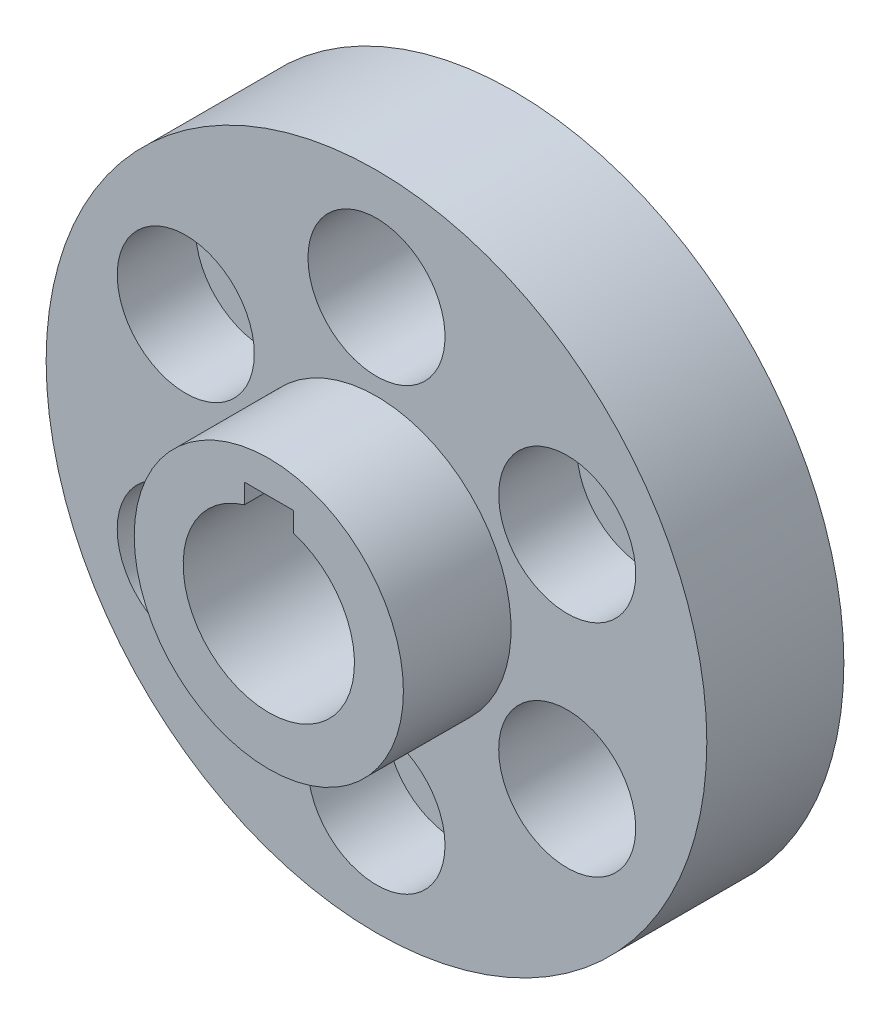
ISO-10303-21;
HEADER;
FILE_DESCRIPTION(('STEP AP214'),'2;1');
FILE_NAME('part.step','',(''),(''),'','','');
FILE_SCHEMA(('AUTOMOTIVE_DESIGN { 1 0 10303 214 1 1 1 1 }'));
ENDSEC;
DATA;
#1=APPLICATION_CONTEXT('core data for automotive mechanical design processes');
#2=APPLICATION_PROTOCOL_DEFINITION('international standard','automotive_design',2000,#1);
#3=PRODUCT_CONTEXT('',#1,'mechanical');
#4=PRODUCT('Part','Part','',(#3));
#5=PRODUCT_RELATED_PRODUCT_CATEGORY('part','',(#4));
#6=PRODUCT_DEFINITION_FORMATION('','',#4);
#7=PRODUCT_DEFINITION_CONTEXT('part definition',#1,'design');
#8=PRODUCT_DEFINITION('design','',#6,#7);
#9=PRODUCT_DEFINITION_SHAPE('','',#8);
#10=(LENGTH_UNIT() NAMED_UNIT(*) SI_UNIT(.MILLI.,.METRE.));
#11=(NAMED_UNIT(*) PLANE_ANGLE_UNIT() SI_UNIT($,.RADIAN.));
#12=(NAMED_UNIT(*) SI_UNIT($,.STERADIAN.) SOLID_ANGLE_UNIT());
#13=UNCERTAINTY_MEASURE_WITH_UNIT(LENGTH_MEASURE(1.E-05),#10,'distance_accuracy_value','');
#14=(GEOMETRIC_REPRESENTATION_CONTEXT(3) GLOBAL_UNCERTAINTY_ASSIGNED_CONTEXT((#13)) GLOBAL_UNIT_ASSIGNED_CONTEXT((#10,
#11,#12)) REPRESENTATION_CONTEXT('',''));
#15=CARTESIAN_POINT('',(0.,0.,0.));
#16=DIRECTION('',(0.,0.,1.));
#17=DIRECTION('',(1.,0.,0.));
#18=AXIS2_PLACEMENT_3D('',#15,#16,#17);
#19=CARTESIAN_POINT('',(0.,0.,50.));
#20=DIRECTION('',(0.,0.,-1.));
#21=DIRECTION('',(-1.,0.,0.));
#22=AXIS2_PLACEMENT_3D('',#19,#20,#21);
#23=CYLINDRICAL_SURFACE('',#22,27.5);
#24=CARTESIAN_POINT('',(0.,0.,50.));
#25=DIRECTION('',(0.,0.,1.));
#26=DIRECTION('',(1.,0.,0.));
#27=AXIS2_PLACEMENT_3D('',#24,#25,#26);
#28=CIRCLE('',#27,27.5);
#29=CARTESIAN_POINT('',(27.5,0.,50.));
#30=VERTEX_POINT('',#29);
#31=EDGE_CURVE('E92',#30,#30,#28,.T.);
#32=ORIENTED_EDGE('',*,*,#31,.F.);
#33=EDGE_LOOP('',(#32));
#34=FACE_BOUND('',#33,.T.);
#35=CARTESIAN_POINT('',(0.,0.,28.));
#36=DIRECTION('',(0.,0.,-1.));
#37=DIRECTION('',(-1.,0.,0.));
#38=AXIS2_PLACEMENT_3D('',#35,#36,#37);
#39=CIRCLE('',#38,27.5);
#40=CARTESIAN_POINT('',(-27.5,0.,28.));
#41=VERTEX_POINT('',#40);
#42=EDGE_CURVE('E101',#41,#41,#39,.T.);
#43=ORIENTED_EDGE('',*,*,#42,.F.);
#44=EDGE_LOOP('',(#43));
#45=FACE_BOUND('',#44,.T.);
#46=ADVANCED_FACE('F42',(#34,#45),#23,.T.);
#47=CARTESIAN_POINT('',(0.,0.,50.));
#48=DIRECTION('',(0.,0.,-1.));
#49=DIRECTION('',(-1.,0.,0.));
#50=AXIS2_PLACEMENT_3D('',#47,#48,#49);
#51=CYLINDRICAL_SURFACE('',#50,17.5);
#52=DIRECTION('',(0.,0.,-1.));
#53=VECTOR('',#52,1.);
#54=CARTESIAN_POINT('',(5.,16.7705098312484,50.));
#55=LINE('',#54,#53);
#56=CARTESIAN_POINT('',(5.,16.7705098312484,50.));
#57=VERTEX_POINT('',#56);
#58=CARTESIAN_POINT('',(5.,16.7705098312484,0.));
#59=VERTEX_POINT('',#58);
#60=EDGE_CURVE('E84',#57,#59,#55,.T.);
#61=ORIENTED_EDGE('',*,*,#60,.T.);
#62=CARTESIAN_POINT('',(0.,0.,0.));
#63=DIRECTION('',(0.,0.,1.));
#64=DIRECTION('',(1.,0.,0.));
#65=AXIS2_PLACEMENT_3D('',#62,#63,#64);
#66=CIRCLE('',#65,17.5);
#67=CARTESIAN_POINT('',(-5.,16.7705098312484,0.));
#68=VERTEX_POINT('',#67);
#69=EDGE_CURVE('E11',#68,#59,#66,.T.);
#70=ORIENTED_EDGE('',*,*,#69,.F.);
#71=DIRECTION('',(0.,0.,-1.));
#72=VECTOR('',#71,1.);
#73=CARTESIAN_POINT('',(-5.,16.7705098312484,50.));
#74=LINE('',#73,#72);
#75=CARTESIAN_POINT('',(-5.,16.7705098312484,50.));
#76=VERTEX_POINT('',#75);
#77=EDGE_CURVE('E116',#76,#68,#74,.T.);
#78=ORIENTED_EDGE('',*,*,#77,.F.);
#79=CARTESIAN_POINT('',(0.,0.,50.));
#80=DIRECTION('',(0.,0.,1.));
#81=DIRECTION('',(1.,0.,0.));
#82=AXIS2_PLACEMENT_3D('',#79,#80,#81);
#83=CIRCLE('',#82,17.5);
#84=EDGE_CURVE('E89',#76,#57,#83,.T.);
#85=ORIENTED_EDGE('',*,*,#84,.T.);
#86=EDGE_LOOP('',(#61,#70,#78,#85));
#87=FACE_BOUND('',#86,.T.);
#88=ADVANCED_FACE('F85',(#87),#51,.F.);
#89=CARTESIAN_POINT('',(5.,20.8,50.));
#90=DIRECTION('',(-1.,0.,0.));
#91=DIRECTION('',(0.,0.,1.));
#92=AXIS2_PLACEMENT_3D('',#89,#90,#91);
#93=PLANE('',#92);
#94=DIRECTION('',(0.,0.,-1.));
#95=VECTOR('',#94,1.);
#96=CARTESIAN_POINT('',(5.,20.8,50.));
#97=LINE('',#96,#95);
#98=CARTESIAN_POINT('',(5.,20.8,50.));
#99=VERTEX_POINT('',#98);
#100=CARTESIAN_POINT('',(5.,20.8,0.));
#101=VERTEX_POINT('',#100);
#102=EDGE_CURVE('E57',#99,#101,#97,.T.);
#103=ORIENTED_EDGE('',*,*,#102,.T.);
#104=DIRECTION('',(0.,1.,0.));
#105=VECTOR('',#104,1.);
#106=CARTESIAN_POINT('',(5.,0.,0.));
#107=LINE('',#106,#105);
#108=EDGE_CURVE('E95',#59,#101,#107,.T.);
#109=ORIENTED_EDGE('',*,*,#108,.F.);
#110=ORIENTED_EDGE('',*,*,#60,.F.);
#111=DIRECTION('',(0.,1.,0.));
#112=VECTOR('',#111,1.);
#113=CARTESIAN_POINT('',(5.,20.8,50.));
#114=LINE('',#113,#112);
#115=EDGE_CURVE('E125',#57,#99,#114,.T.);
#116=ORIENTED_EDGE('',*,*,#115,.T.);
#117=EDGE_LOOP('',(#103,#109,#110,#116));
#118=FACE_BOUND('',#117,.T.);
#119=ADVANCED_FACE('F96',(#118),#93,.T.);
#120=CARTESIAN_POINT('',(-5.,20.8,50.));
#121=DIRECTION('',(0.,-1.,0.));
#122=DIRECTION('',(0.,0.,-1.));
#123=AXIS2_PLACEMENT_3D('',#120,#121,#122);
#124=PLANE('',#123);
#125=DIRECTION('',(0.,0.,-1.));
#126=VECTOR('',#125,1.);
#127=CARTESIAN_POINT('',(-5.,20.8,50.));
#128=LINE('',#127,#126);
#129=CARTESIAN_POINT('',(-5.,20.8,50.));
#130=VERTEX_POINT('',#129);
#131=CARTESIAN_POINT('',(-5.,20.8,0.));
#132=VERTEX_POINT('',#131);
#133=EDGE_CURVE('E65',#130,#132,#128,.T.);
#134=ORIENTED_EDGE('',*,*,#133,.T.);
#135=DIRECTION('',(-1.,0.,0.));
#136=VECTOR('',#135,1.);
#137=CARTESIAN_POINT('',(0.,20.8,0.));
#138=LINE('',#137,#136);
#139=EDGE_CURVE('E100',#101,#132,#138,.T.);
#140=ORIENTED_EDGE('',*,*,#139,.F.);
#141=ORIENTED_EDGE('',*,*,#102,.F.);
#142=DIRECTION('',(-1.,0.,0.));
#143=VECTOR('',#142,1.);
#144=CARTESIAN_POINT('',(-5.,20.8,50.));
#145=LINE('',#144,#143);
#146=EDGE_CURVE('E122',#99,#130,#145,.T.);
#147=ORIENTED_EDGE('',*,*,#146,.T.);
#148=EDGE_LOOP('',(#134,#140,#141,#147));
#149=FACE_BOUND('',#148,.T.);
#150=ADVANCED_FACE('F258',(#149),#124,.T.);
#151=CARTESIAN_POINT('',(-5.,20.8,50.));
#152=DIRECTION('',(1.,0.,0.));
#153=DIRECTION('',(0.,0.,-1.));
#154=AXIS2_PLACEMENT_3D('',#151,#152,#153);
#155=PLANE('',#154);
#156=ORIENTED_EDGE('',*,*,#77,.T.);
#157=DIRECTION('',(0.,-1.,0.));
#158=VECTOR('',#157,1.);
#159=CARTESIAN_POINT('',(-5.,0.,0.));
#160=LINE('',#159,#158);
#161=EDGE_CURVE('E50',#132,#68,#160,.T.);
#162=ORIENTED_EDGE('',*,*,#161,.F.);
#163=ORIENTED_EDGE('',*,*,#133,.F.);
#164=DIRECTION('',(0.,-1.,0.));
#165=VECTOR('',#164,1.);
#166=CARTESIAN_POINT('',(-5.,20.8,50.));
#167=LINE('',#166,#165);
#168=EDGE_CURVE('E119',#130,#76,#167,.T.);
#169=ORIENTED_EDGE('',*,*,#168,.T.);
#170=EDGE_LOOP('',(#156,#162,#163,#169));
#171=FACE_BOUND('',#170,.T.);
#172=ADVANCED_FACE('F253',(#171),#155,.T.);
#173=CARTESIAN_POINT('',(0.,0.,50.));
#174=DIRECTION('',(0.,0.,1.));
#175=DIRECTION('',(1.,0.,0.));
#176=AXIS2_PLACEMENT_3D('',#173,#174,#175);
#177=PLANE('',#176);
#178=ORIENTED_EDGE('',*,*,#31,.T.);
#179=EDGE_LOOP('',(#178));
#180=FACE_BOUND('',#179,.T.);
#181=ORIENTED_EDGE('',*,*,#115,.F.);
#182=ORIENTED_EDGE('',*,*,#84,.F.);
#183=ORIENTED_EDGE('',*,*,#168,.F.);
#184=ORIENTED_EDGE('',*,*,#146,.F.);
#185=EDGE_LOOP('',(#181,#182,#183,#184));
#186=FACE_BOUND('',#185,.T.);
#187=ADVANCED_FACE('F227',(#180,#186),#177,.T.);
#188=CARTESIAN_POINT('',(0.,0.,28.));
#189=DIRECTION('',(0.,0.,-1.));
#190=DIRECTION('',(-1.,0.,0.));
#191=AXIS2_PLACEMENT_3D('',#188,#189,#190);
#192=PLANE('',#191);
#193=CARTESIAN_POINT('',(0.,-45.,28.));
#194=DIRECTION('',(0.,0.,1.));
#195=DIRECTION('',(1.,0.,0.));
#196=AXIS2_PLACEMENT_3D('',#193,#194,#195);
#197=CIRCLE('',#196,14.);
#198=CARTESIAN_POINT('',(14.,-45.,28.));
#199=VERTEX_POINT('',#198);
#200=EDGE_CURVE('E206',#199,#199,#197,.T.);
#201=ORIENTED_EDGE('',*,*,#200,.F.);
#202=EDGE_LOOP('',(#201));
#203=FACE_BOUND('',#202,.T.);
#204=CARTESIAN_POINT('',(-38.9711431702996,22.5000000000002,28.));
#205=DIRECTION('',(0.,0.,1.));
#206=DIRECTION('',(1.,0.,0.));
#207=AXIS2_PLACEMENT_3D('',#204,#205,#206);
#208=CIRCLE('',#207,14.);
#209=CARTESIAN_POINT('',(-24.9711431702996,22.5000000000002,28.));
#210=VERTEX_POINT('',#209);
#211=EDGE_CURVE('E202',#210,#210,#208,.T.);
#212=ORIENTED_EDGE('',*,*,#211,.F.);
#213=EDGE_LOOP('',(#212));
#214=FACE_BOUND('',#213,.T.);
#215=CARTESIAN_POINT('',(38.9711431702999,22.4999999999996,28.));
#216=DIRECTION('',(0.,0.,1.));
#217=DIRECTION('',(1.,0.,0.));
#218=AXIS2_PLACEMENT_3D('',#215,#216,#217);
#219=CIRCLE('',#218,14.);
#220=CARTESIAN_POINT('',(52.9711431703,22.4999999999996,28.));
#221=VERTEX_POINT('',#220);
#222=EDGE_CURVE('E194',#221,#221,#219,.T.);
#223=ORIENTED_EDGE('',*,*,#222,.F.);
#224=EDGE_LOOP('',(#223));
#225=FACE_BOUND('',#224,.T.);
#226=CARTESIAN_POINT('',(0.,0.,28.));
#227=DIRECTION('',(0.,0.,-1.));
#228=DIRECTION('',(-1.,0.,0.));
#229=AXIS2_PLACEMENT_3D('',#226,#227,#228);
#230=CIRCLE('',#229,67.5);
#231=CARTESIAN_POINT('',(-67.5,0.,28.));
#232=VERTEX_POINT('',#231);
#233=EDGE_CURVE('E130',#232,#232,#230,.T.);
#234=ORIENTED_EDGE('',*,*,#233,.F.);
#235=EDGE_LOOP('',(#234));
#236=FACE_BOUND('',#235,.T.);
#237=CARTESIAN_POINT('',(0.,45.,28.));
#238=DIRECTION('',(0.,0.,-1.));
#239=DIRECTION('',(-1.,0.,0.));
#240=AXIS2_PLACEMENT_3D('',#237,#238,#239);
#241=CIRCLE('',#240,14.);
#242=CARTESIAN_POINT('',(-14.,45.,28.));
#243=VERTEX_POINT('',#242);
#244=EDGE_CURVE('E138',#243,#243,#241,.T.);
#245=ORIENTED_EDGE('',*,*,#244,.T.);
#246=EDGE_LOOP('',(#245));
#247=FACE_BOUND('',#246,.T.);
#248=CARTESIAN_POINT('',(-38.9711431702996,-22.5000000000002,28.));
#249=DIRECTION('',(0.,0.,-1.));
#250=DIRECTION('',(-1.,0.,0.));
#251=AXIS2_PLACEMENT_3D('',#248,#249,#250);
#252=CIRCLE('',#251,14.);
#253=CARTESIAN_POINT('',(-52.9711431702996,-22.5000000000002,28.));
#254=VERTEX_POINT('',#253);
#255=EDGE_CURVE('E146',#254,#254,#252,.T.);
#256=ORIENTED_EDGE('',*,*,#255,.T.);
#257=EDGE_LOOP('',(#256));
#258=FACE_BOUND('',#257,.T.);
#259=CARTESIAN_POINT('',(38.9711431702999,-22.4999999999996,28.));
#260=DIRECTION('',(0.,0.,-1.));
#261=DIRECTION('',(-1.,0.,0.));
#262=AXIS2_PLACEMENT_3D('',#259,#260,#261);
#263=CIRCLE('',#262,14.);
#264=CARTESIAN_POINT('',(24.9711431702999,-22.4999999999996,28.));
#265=VERTEX_POINT('',#264);
#266=EDGE_CURVE('E154',#265,#265,#263,.T.);
#267=ORIENTED_EDGE('',*,*,#266,.T.);
#268=EDGE_LOOP('',(#267));
#269=FACE_BOUND('',#268,.T.);
#270=ORIENTED_EDGE('',*,*,#42,.T.);
#271=EDGE_LOOP('',(#270));
#272=FACE_BOUND('',#271,.T.);
#273=ADVANCED_FACE('F223',(#203,#214,#225,#236,#247,#258,#269,#272),#192,.F.);
#274=CARTESIAN_POINT('',(0.,0.,28.));
#275=DIRECTION('',(0.,0.,-1.));
#276=DIRECTION('',(-1.,0.,0.));
#277=AXIS2_PLACEMENT_3D('',#274,#275,#276);
#278=CYLINDRICAL_SURFACE('',#277,67.5);
#279=ORIENTED_EDGE('',*,*,#233,.T.);
#280=EDGE_LOOP('',(#279));
#281=FACE_BOUND('',#280,.T.);
#282=CARTESIAN_POINT('',(0.,0.,0.));
#283=DIRECTION('',(0.,0.,-1.));
#284=DIRECTION('',(-1.,0.,0.));
#285=AXIS2_PLACEMENT_3D('',#282,#283,#284);
#286=CIRCLE('',#285,67.5);
#287=CARTESIAN_POINT('',(-67.5,0.,0.));
#288=VERTEX_POINT('',#287);
#289=EDGE_CURVE('E134',#288,#288,#286,.T.);
#290=ORIENTED_EDGE('',*,*,#289,.F.);
#291=EDGE_LOOP('',(#290));
#292=FACE_BOUND('',#291,.T.);
#293=ADVANCED_FACE('F226',(#281,#292),#278,.T.);
#294=CARTESIAN_POINT('',(0.,45.,28.));
#295=DIRECTION('',(0.,0.,-1.));
#296=DIRECTION('',(-1.,0.,0.));
#297=AXIS2_PLACEMENT_3D('',#294,#295,#296);
#298=CYLINDRICAL_SURFACE('',#297,14.);
#299=ORIENTED_EDGE('',*,*,#244,.F.);
#300=EDGE_LOOP('',(#299));
#301=FACE_BOUND('',#300,.T.);
#302=CARTESIAN_POINT('',(0.,45.,0.));
#303=DIRECTION('',(0.,0.,-1.));
#304=DIRECTION('',(-1.,0.,0.));
#305=AXIS2_PLACEMENT_3D('',#302,#303,#304);
#306=CIRCLE('',#305,14.);
#307=CARTESIAN_POINT('',(-14.,45.,0.));
#308=VERTEX_POINT('',#307);
#309=EDGE_CURVE('E142',#308,#308,#306,.T.);
#310=ORIENTED_EDGE('',*,*,#309,.T.);
#311=EDGE_LOOP('',(#310));
#312=FACE_BOUND('',#311,.T.);
#313=ADVANCED_FACE('F284',(#301,#312),#298,.F.);
#314=CARTESIAN_POINT('',(-38.9711431702996,-22.5000000000002,28.));
#315=DIRECTION('',(0.,0.,-1.));
#316=DIRECTION('',(-1.,0.,0.));
#317=AXIS2_PLACEMENT_3D('',#314,#315,#316);
#318=CYLINDRICAL_SURFACE('',#317,14.);
#319=ORIENTED_EDGE('',*,*,#255,.F.);
#320=EDGE_LOOP('',(#319));
#321=FACE_BOUND('',#320,.T.);
#322=CARTESIAN_POINT('',(-38.9711431702996,-22.5000000000002,0.));
#323=DIRECTION('',(0.,0.,-1.));
#324=DIRECTION('',(-1.,0.,0.));
#325=AXIS2_PLACEMENT_3D('',#322,#323,#324);
#326=CIRCLE('',#325,14.);
#327=CARTESIAN_POINT('',(-52.9711431702996,-22.5000000000002,0.));
#328=VERTEX_POINT('',#327);
#329=EDGE_CURVE('E150',#328,#328,#326,.T.);
#330=ORIENTED_EDGE('',*,*,#329,.T.);
#331=EDGE_LOOP('',(#330));
#332=FACE_BOUND('',#331,.T.);
#333=ADVANCED_FACE('F278',(#321,#332),#318,.F.);
#334=CARTESIAN_POINT('',(38.9711431702999,-22.4999999999996,28.));
#335=DIRECTION('',(0.,0.,-1.));
#336=DIRECTION('',(-1.,0.,0.));
#337=AXIS2_PLACEMENT_3D('',#334,#335,#336);
#338=CYLINDRICAL_SURFACE('',#337,14.);
#339=ORIENTED_EDGE('',*,*,#266,.F.);
#340=EDGE_LOOP('',(#339));
#341=FACE_BOUND('',#340,.T.);
#342=CARTESIAN_POINT('',(38.9711431702999,-22.4999999999996,0.));
#343=DIRECTION('',(0.,0.,-1.));
#344=DIRECTION('',(-1.,0.,0.));
#345=AXIS2_PLACEMENT_3D('',#342,#343,#344);
#346=CIRCLE('',#345,14.);
#347=CARTESIAN_POINT('',(24.9711431702999,-22.4999999999996,0.));
#348=VERTEX_POINT('',#347);
#349=EDGE_CURVE('E158',#348,#348,#346,.T.);
#350=ORIENTED_EDGE('',*,*,#349,.T.);
#351=EDGE_LOOP('',(#350));
#352=FACE_BOUND('',#351,.T.);
#353=ADVANCED_FACE('F270',(#341,#352),#338,.F.);
#354=CARTESIAN_POINT('',(0.,0.,0.));
#355=DIRECTION('',(0.,0.,1.));
#356=DIRECTION('',(1.,0.,0.));
#357=AXIS2_PLACEMENT_3D('',#354,#355,#356);
#358=PLANE('',#357);
#359=ORIENTED_EDGE('',*,*,#161,.T.);
#360=ORIENTED_EDGE('',*,*,#69,.T.);
#361=ORIENTED_EDGE('',*,*,#108,.T.);
#362=ORIENTED_EDGE('',*,*,#139,.T.);
#363=EDGE_LOOP('',(#359,#360,#361,#362));
#364=FACE_BOUND('',#363,.T.);
#365=CARTESIAN_POINT('',(0.,-45.,0.));
#366=DIRECTION('',(0.,0.,-1.));
#367=DIRECTION('',(-1.,0.,0.));
#368=AXIS2_PLACEMENT_3D('',#365,#366,#367);
#369=CIRCLE('',#368,9.);
#370=CARTESIAN_POINT('',(-9.,-45.,0.));
#371=VERTEX_POINT('',#370);
#372=EDGE_CURVE('E162',#371,#371,#369,.T.);
#373=ORIENTED_EDGE('',*,*,#372,.F.);
#374=EDGE_LOOP('',(#373));
#375=FACE_BOUND('',#374,.T.);
#376=CARTESIAN_POINT('',(38.9711431702996,22.5000000000002,0.));
#377=DIRECTION('',(0.,0.,-1.));
#378=DIRECTION('',(-1.,0.,0.));
#379=AXIS2_PLACEMENT_3D('',#376,#377,#378);
#380=CIRCLE('',#379,9.);
#381=CARTESIAN_POINT('',(29.9711431702996,22.5000000000002,0.));
#382=VERTEX_POINT('',#381);
#383=EDGE_CURVE('E170',#382,#382,#380,.T.);
#384=ORIENTED_EDGE('',*,*,#383,.F.);
#385=EDGE_LOOP('',(#384));
#386=FACE_BOUND('',#385,.T.);
#387=CARTESIAN_POINT('',(-38.9711431702999,22.4999999999996,0.));
#388=DIRECTION('',(0.,0.,-1.));
#389=DIRECTION('',(-1.,0.,0.));
#390=AXIS2_PLACEMENT_3D('',#387,#388,#389);
#391=CIRCLE('',#390,9.);
#392=CARTESIAN_POINT('',(-47.9711431702999,22.4999999999996,0.));
#393=VERTEX_POINT('',#392);
#394=EDGE_CURVE('E166',#393,#393,#391,.T.);
#395=ORIENTED_EDGE('',*,*,#394,.F.);
#396=EDGE_LOOP('',(#395));
#397=FACE_BOUND('',#396,.T.);
#398=ORIENTED_EDGE('',*,*,#349,.F.);
#399=EDGE_LOOP('',(#398));
#400=FACE_BOUND('',#399,.T.);
#401=ORIENTED_EDGE('',*,*,#329,.F.);
#402=EDGE_LOOP('',(#401));
#403=FACE_BOUND('',#402,.T.);
#404=ORIENTED_EDGE('',*,*,#309,.F.);
#405=EDGE_LOOP('',(#404));
#406=FACE_BOUND('',#405,.T.);
#407=ORIENTED_EDGE('',*,*,#289,.T.);
#408=EDGE_LOOP('',(#407));
#409=FACE_BOUND('',#408,.T.);
#410=ADVANCED_FACE('F103',(#364,#375,#386,#397,#400,#403,#406,#409),#358,.F.);
#411=CARTESIAN_POINT('',(-38.9711431702999,22.4999999999996,0.));
#412=DIRECTION('',(0.,0.,-1.));
#413=DIRECTION('',(-1.,0.,0.));
#414=AXIS2_PLACEMENT_3D('',#411,#412,#413);
#415=CONICAL_SURFACE('',#414,9.,0.130899693899575);
#416=CARTESIAN_POINT('',(-38.9711431702999,22.4999999999996,12.));
#417=DIRECTION('',(0.,0.,-1.));
#418=DIRECTION('',(-1.,0.,0.));
#419=AXIS2_PLACEMENT_3D('',#416,#417,#418);
#420=CIRCLE('',#419,7.42017002895125);
#421=CARTESIAN_POINT('',(-46.3913131992512,22.4999999999996,12.));
#422=VERTEX_POINT('',#421);
#423=EDGE_CURVE('E171',#422,#422,#420,.T.);
#424=ORIENTED_EDGE('',*,*,#423,.F.);
#425=EDGE_LOOP('',(#424));
#426=FACE_BOUND('',#425,.T.);
#427=ORIENTED_EDGE('',*,*,#394,.T.);
#428=EDGE_LOOP('',(#427));
#429=FACE_BOUND('',#428,.T.);
#430=ADVANCED_FACE('F269',(#426,#429),#415,.F.);
#431=CARTESIAN_POINT('',(38.9711431702996,22.5000000000002,0.));
#432=DIRECTION('',(0.,0.,-1.));
#433=DIRECTION('',(-1.,0.,0.));
#434=AXIS2_PLACEMENT_3D('',#431,#432,#433);
#435=CONICAL_SURFACE('',#434,9.,0.130899693899575);
#436=CARTESIAN_POINT('',(38.9711431702996,22.5000000000002,12.));
#437=DIRECTION('',(0.,0.,-1.));
#438=DIRECTION('',(-1.,0.,0.));
#439=AXIS2_PLACEMENT_3D('',#436,#437,#438);
#440=CIRCLE('',#439,7.42017002895125);
#441=CARTESIAN_POINT('',(31.5509731413484,22.5000000000002,12.));
#442=VERTEX_POINT('',#441);
#443=EDGE_CURVE('E175',#442,#442,#440,.T.);
#444=ORIENTED_EDGE('',*,*,#443,.F.);
#445=EDGE_LOOP('',(#444));
#446=FACE_BOUND('',#445,.T.);
#447=ORIENTED_EDGE('',*,*,#383,.T.);
#448=EDGE_LOOP('',(#447));
#449=FACE_BOUND('',#448,.T.);
#450=ADVANCED_FACE('F275',(#446,#449),#435,.F.);
#451=CARTESIAN_POINT('',(0.,-45.,0.));
#452=DIRECTION('',(0.,0.,-1.));
#453=DIRECTION('',(-1.,0.,0.));
#454=AXIS2_PLACEMENT_3D('',#451,#452,#453);
#455=CONICAL_SURFACE('',#454,9.,0.130899693899575);
#456=CARTESIAN_POINT('',(0.,-45.,12.));
#457=DIRECTION('',(0.,0.,-1.));
#458=DIRECTION('',(-1.,0.,0.));
#459=AXIS2_PLACEMENT_3D('',#456,#457,#458);
#460=CIRCLE('',#459,7.42017002895125);
#461=CARTESIAN_POINT('',(-7.42017002895125,-45.,12.));
#462=VERTEX_POINT('',#461);
#463=EDGE_CURVE('E182',#462,#462,#460,.T.);
#464=ORIENTED_EDGE('',*,*,#463,.F.);
#465=EDGE_LOOP('',(#464));
#466=FACE_BOUND('',#465,.T.);
#467=ORIENTED_EDGE('',*,*,#372,.T.);
#468=EDGE_LOOP('',(#467));
#469=FACE_BOUND('',#468,.T.);
#470=ADVANCED_FACE('F367',(#466,#469),#455,.F.);
#471=CARTESIAN_POINT('',(38.9711431702999,22.4999999999996,12.));
#472=DIRECTION('',(0.,0.,1.));
#473=DIRECTION('',(1.,0.,0.));
#474=AXIS2_PLACEMENT_3D('',#471,#472,#473);
#475=PLANE('',#474);
#476=CARTESIAN_POINT('',(38.9711431702999,22.4999999999996,12.));
#477=DIRECTION('',(0.,0.,1.));
#478=DIRECTION('',(1.,0.,0.));
#479=AXIS2_PLACEMENT_3D('',#476,#477,#478);
#480=CIRCLE('',#479,14.);
#481=CARTESIAN_POINT('',(52.9711431703,22.4999999999996,12.));
#482=VERTEX_POINT('',#481);
#483=EDGE_CURVE('E190',#482,#482,#480,.T.);
#484=ORIENTED_EDGE('',*,*,#483,.T.);
#485=EDGE_LOOP('',(#484));
#486=FACE_BOUND('',#485,.T.);
#487=ORIENTED_EDGE('',*,*,#443,.T.);
#488=EDGE_LOOP('',(#487));
#489=FACE_BOUND('',#488,.T.);
#490=ADVANCED_FACE('F376',(#486,#489),#475,.T.);
#491=CARTESIAN_POINT('',(38.9711431702999,22.4999999999996,12.));
#492=DIRECTION('',(0.,0.,1.));
#493=DIRECTION('',(1.,0.,0.));
#494=AXIS2_PLACEMENT_3D('',#491,#492,#493);
#495=CYLINDRICAL_SURFACE('',#494,14.);
#496=ORIENTED_EDGE('',*,*,#483,.F.);
#497=EDGE_LOOP('',(#496));
#498=FACE_BOUND('',#497,.T.);
#499=ORIENTED_EDGE('',*,*,#222,.T.);
#500=EDGE_LOOP('',(#499));
#501=FACE_BOUND('',#500,.T.);
#502=ADVANCED_FACE('F385',(#498,#501),#495,.F.);
#503=CARTESIAN_POINT('',(-38.9711431702996,22.5000000000002,12.));
#504=DIRECTION('',(0.,0.,1.));
#505=DIRECTION('',(1.,0.,0.));
#506=AXIS2_PLACEMENT_3D('',#503,#504,#505);
#507=PLANE('',#506);
#508=CARTESIAN_POINT('',(-38.9711431702996,22.5000000000002,12.));
#509=DIRECTION('',(0.,0.,1.));
#510=DIRECTION('',(1.,0.,0.));
#511=AXIS2_PLACEMENT_3D('',#508,#509,#510);
#512=CIRCLE('',#511,14.);
#513=CARTESIAN_POINT('',(-24.9711431702996,22.5000000000002,12.));
#514=VERTEX_POINT('',#513);
#515=EDGE_CURVE('E198',#514,#514,#512,.T.);
#516=ORIENTED_EDGE('',*,*,#515,.T.);
#517=EDGE_LOOP('',(#516));
#518=FACE_BOUND('',#517,.T.);
#519=ORIENTED_EDGE('',*,*,#423,.T.);
#520=EDGE_LOOP('',(#519));
#521=FACE_BOUND('',#520,.T.);
#522=ADVANCED_FACE('F394',(#518,#521),#507,.T.);
#523=CARTESIAN_POINT('',(-38.9711431702996,22.5000000000002,12.));
#524=DIRECTION('',(0.,0.,1.));
#525=DIRECTION('',(1.,0.,0.));
#526=AXIS2_PLACEMENT_3D('',#523,#524,#525);
#527=CYLINDRICAL_SURFACE('',#526,14.);
#528=ORIENTED_EDGE('',*,*,#515,.F.);
#529=EDGE_LOOP('',(#528));
#530=FACE_BOUND('',#529,.T.);
#531=ORIENTED_EDGE('',*,*,#211,.T.);
#532=EDGE_LOOP('',(#531));
#533=FACE_BOUND('',#532,.T.);
#534=ADVANCED_FACE('F404',(#530,#533),#527,.F.);
#535=CARTESIAN_POINT('',(0.,-45.,12.));
#536=DIRECTION('',(0.,0.,1.));
#537=DIRECTION('',(1.,0.,0.));
#538=AXIS2_PLACEMENT_3D('',#535,#536,#537);
#539=PLANE('',#538);
#540=CARTESIAN_POINT('',(0.,-45.,12.));
#541=DIRECTION('',(0.,0.,1.));
#542=DIRECTION('',(1.,0.,0.));
#543=AXIS2_PLACEMENT_3D('',#540,#541,#542);
#544=CIRCLE('',#543,14.);
#545=CARTESIAN_POINT('',(14.,-45.,12.));
#546=VERTEX_POINT('',#545);
#547=EDGE_CURVE('E186',#546,#546,#544,.T.);
#548=ORIENTED_EDGE('',*,*,#547,.T.);
#549=EDGE_LOOP('',(#548));
#550=FACE_BOUND('',#549,.T.);
#551=ORIENTED_EDGE('',*,*,#463,.T.);
#552=EDGE_LOOP('',(#551));
#553=FACE_BOUND('',#552,.T.);
#554=ADVANCED_FACE('F214',(#550,#553),#539,.T.);
#555=CARTESIAN_POINT('',(0.,-45.,12.));
#556=DIRECTION('',(0.,0.,1.));
#557=DIRECTION('',(1.,0.,0.));
#558=AXIS2_PLACEMENT_3D('',#555,#556,#557);
#559=CYLINDRICAL_SURFACE('',#558,14.);
#560=ORIENTED_EDGE('',*,*,#547,.F.);
#561=EDGE_LOOP('',(#560));
#562=FACE_BOUND('',#561,.T.);
#563=ORIENTED_EDGE('',*,*,#200,.T.);
#564=EDGE_LOOP('',(#563));
#565=FACE_BOUND('',#564,.T.);
#566=ADVANCED_FACE('F217',(#562,#565),#559,.F.);
#567=CLOSED_SHELL('',(#46,#88,#119,#150,#172,#187,#273,#293,#313,#333,#353,#410,#430,#450,#470,
#490,#502,#522,#534,#554,#566));
#568=MANIFOLD_SOLID_BREP('B2',#567);
#569=ADVANCED_BREP_SHAPE_REPRESENTATION('',(#18,#568),#14);
#570=SHAPE_DEFINITION_REPRESENTATION(#9,#569);
ENDSEC;
END-ISO-10303-21;
